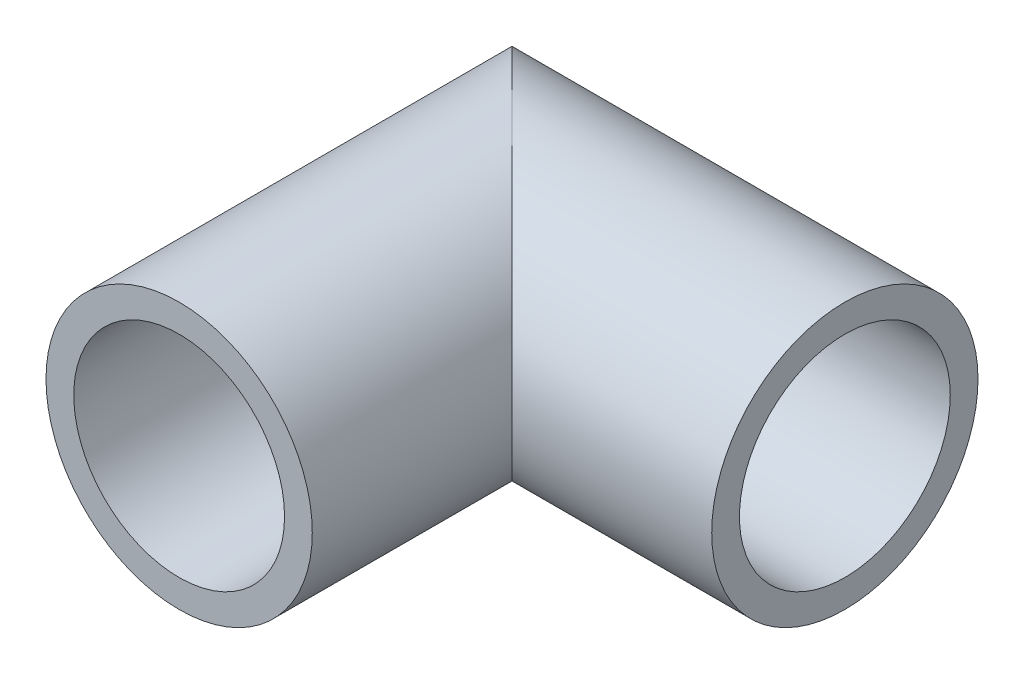
ISO-10303-21;
HEADER;
FILE_DESCRIPTION(('STEP AP214'),'2;1');
FILE_NAME('part.step','',(''),(''),'','','');
FILE_SCHEMA(('AUTOMOTIVE_DESIGN { 1 0 10303 214 1 1 1 1 }'));
ENDSEC;
DATA;
#1=APPLICATION_CONTEXT('core data for automotive mechanical design processes');
#2=APPLICATION_PROTOCOL_DEFINITION('international standard','automotive_design',2000,#1);
#3=PRODUCT_CONTEXT('',#1,'mechanical');
#4=PRODUCT('Part','Part','',(#3));
#5=PRODUCT_RELATED_PRODUCT_CATEGORY('part','',(#4));
#6=PRODUCT_DEFINITION_FORMATION('','',#4);
#7=PRODUCT_DEFINITION_CONTEXT('part definition',#1,'design');
#8=PRODUCT_DEFINITION('design','',#6,#7);
#9=PRODUCT_DEFINITION_SHAPE('','',#8);
#10=(LENGTH_UNIT() NAMED_UNIT(*) SI_UNIT(.MILLI.,.METRE.));
#11=(NAMED_UNIT(*) PLANE_ANGLE_UNIT() SI_UNIT($,.RADIAN.));
#12=(NAMED_UNIT(*) SI_UNIT($,.STERADIAN.) SOLID_ANGLE_UNIT());
#13=UNCERTAINTY_MEASURE_WITH_UNIT(LENGTH_MEASURE(1.E-05),#10,'distance_accuracy_value','');
#14=(GEOMETRIC_REPRESENTATION_CONTEXT(3) GLOBAL_UNCERTAINTY_ASSIGNED_CONTEXT((#13)) GLOBAL_UNIT_ASSIGNED_CONTEXT((#10,
#11,#12)) REPRESENTATION_CONTEXT('',''));
#15=CARTESIAN_POINT('',(0.,0.,0.));
#16=DIRECTION('',(0.,0.,1.));
#17=DIRECTION('',(1.,0.,0.));
#18=AXIS2_PLACEMENT_3D('',#15,#16,#17);
#19=CARTESIAN_POINT('',(0.,0.,-76.2));
#20=DIRECTION('',(1.,0.,0.));
#21=DIRECTION('',(0.,0.,-1.));
#22=AXIS2_PLACEMENT_3D('',#19,#20,#21);
#23=CYLINDRICAL_SURFACE('',#22,30.48);
#24=CARTESIAN_POINT('',(0.,0.,-76.2));
#25=DIRECTION('',(0.707106781186548,0.,-0.707106781186548));
#26=DIRECTION('',(0.707106781186548,0.,0.707106781186548));
#27=AXIS2_PLACEMENT_3D('',#24,#25,#26);
#28=ELLIPSE('',#27,43.1052293811319,30.48);
#29=CARTESIAN_POINT('',(30.48,0.,-45.72));
#30=VERTEX_POINT('',#29);
#31=EDGE_CURVE('E48',#30,#30,#28,.F.);
#32=ORIENTED_EDGE('',*,*,#31,.F.);
#33=EDGE_LOOP('',(#32));
#34=FACE_BOUND('',#33,.T.);
#35=CARTESIAN_POINT('',(76.2,0.,-76.2));
#36=DIRECTION('',(1.,0.,0.));
#37=DIRECTION('',(0.,0.,-1.));
#38=AXIS2_PLACEMENT_3D('',#35,#36,#37);
#39=CIRCLE('',#38,30.48);
#40=CARTESIAN_POINT('',(76.2,0.,-106.68));
#41=VERTEX_POINT('',#40);
#42=EDGE_CURVE('E11',#41,#41,#39,.T.);
#43=ORIENTED_EDGE('',*,*,#42,.F.);
#44=EDGE_LOOP('',(#43));
#45=FACE_BOUND('',#44,.T.);
#46=ADVANCED_FACE('F32',(#34,#45),#23,.T.);
#47=CARTESIAN_POINT('',(0.,0.,-76.2));
#48=DIRECTION('',(1.,0.,0.));
#49=DIRECTION('',(0.,0.,-1.));
#50=AXIS2_PLACEMENT_3D('',#47,#48,#49);
#51=CYLINDRICAL_SURFACE('',#50,24.13);
#52=CARTESIAN_POINT('',(0.,0.,-76.2));
#53=DIRECTION('',(0.707106781186548,0.,-0.707106781186548));
#54=DIRECTION('',(0.707106781186548,0.,0.707106781186548));
#55=AXIS2_PLACEMENT_3D('',#52,#53,#54);
#56=ELLIPSE('',#55,34.1249732600628,24.13);
#57=CARTESIAN_POINT('',(24.13,0.,-52.07));
#58=VERTEX_POINT('',#57);
#59=EDGE_CURVE('E44',#58,#58,#56,.F.);
#60=ORIENTED_EDGE('',*,*,#59,.T.);
#61=EDGE_LOOP('',(#60));
#62=FACE_BOUND('',#61,.T.);
#63=CARTESIAN_POINT('',(76.2,0.,-76.2));
#64=DIRECTION('',(1.,0.,0.));
#65=DIRECTION('',(0.,0.,-1.));
#66=AXIS2_PLACEMENT_3D('',#63,#64,#65);
#67=CIRCLE('',#66,24.13);
#68=CARTESIAN_POINT('',(76.2,0.,-100.33));
#69=VERTEX_POINT('',#68);
#70=EDGE_CURVE('E36',#69,#69,#67,.T.);
#71=ORIENTED_EDGE('',*,*,#70,.T.);
#72=EDGE_LOOP('',(#71));
#73=FACE_BOUND('',#72,.T.);
#74=ADVANCED_FACE('F34',(#62,#73),#51,.F.);
#75=CARTESIAN_POINT('',(0.,0.,-162.410458762264));
#76=DIRECTION('',(0.,0.,1.));
#77=DIRECTION('',(1.,0.,0.));
#78=AXIS2_PLACEMENT_3D('',#75,#76,#77);
#79=CYLINDRICAL_SURFACE('',#78,24.13);
#80=CARTESIAN_POINT('',(0.,0.,0.));
#81=DIRECTION('',(0.,0.,1.));
#82=DIRECTION('',(1.,0.,0.));
#83=AXIS2_PLACEMENT_3D('',#80,#81,#82);
#84=CIRCLE('',#83,24.13);
#85=CARTESIAN_POINT('',(24.13,0.,0.));
#86=VERTEX_POINT('',#85);
#87=EDGE_CURVE('E49',#86,#86,#84,.T.);
#88=ORIENTED_EDGE('',*,*,#87,.T.);
#89=EDGE_LOOP('',(#88));
#90=FACE_BOUND('',#89,.T.);
#91=ORIENTED_EDGE('',*,*,#59,.F.);
#92=EDGE_LOOP('',(#91));
#93=FACE_BOUND('',#92,.T.);
#94=ADVANCED_FACE('F64',(#90,#93),#79,.F.);
#95=CARTESIAN_POINT('',(0.,0.,0.));
#96=DIRECTION('',(0.,0.,1.));
#97=DIRECTION('',(1.,0.,0.));
#98=AXIS2_PLACEMENT_3D('',#95,#96,#97);
#99=PLANE('',#98);
#100=ORIENTED_EDGE('',*,*,#87,.F.);
#101=EDGE_LOOP('',(#100));
#102=FACE_BOUND('',#101,.T.);
#103=CARTESIAN_POINT('',(0.,0.,0.));
#104=DIRECTION('',(0.,0.,1.));
#105=DIRECTION('',(1.,0.,0.));
#106=AXIS2_PLACEMENT_3D('',#103,#104,#105);
#107=CIRCLE('',#106,30.48);
#108=CARTESIAN_POINT('',(30.48,0.,0.));
#109=VERTEX_POINT('',#108);
#110=EDGE_CURVE('E52',#109,#109,#107,.T.);
#111=ORIENTED_EDGE('',*,*,#110,.T.);
#112=EDGE_LOOP('',(#111));
#113=FACE_BOUND('',#112,.T.);
#114=ADVANCED_FACE('F69',(#102,#113),#99,.T.);
#115=CARTESIAN_POINT('',(0.,0.,-162.410458762264));
#116=DIRECTION('',(0.,0.,1.));
#117=DIRECTION('',(1.,0.,0.));
#118=AXIS2_PLACEMENT_3D('',#115,#116,#117);
#119=CYLINDRICAL_SURFACE('',#118,30.48);
#120=ORIENTED_EDGE('',*,*,#110,.F.);
#121=EDGE_LOOP('',(#120));
#122=FACE_BOUND('',#121,.T.);
#123=ORIENTED_EDGE('',*,*,#31,.T.);
#124=EDGE_LOOP('',(#123));
#125=FACE_BOUND('',#124,.T.);
#126=ADVANCED_FACE('F57',(#122,#125),#119,.T.);
#127=CARTESIAN_POINT('',(76.2,0.,-76.2));
#128=DIRECTION('',(1.,0.,0.));
#129=DIRECTION('',(0.,0.,-1.));
#130=AXIS2_PLACEMENT_3D('',#127,#128,#129);
#131=PLANE('',#130);
#132=ORIENTED_EDGE('',*,*,#70,.F.);
#133=EDGE_LOOP('',(#132));
#134=FACE_BOUND('',#133,.T.);
#135=ORIENTED_EDGE('',*,*,#42,.T.);
#136=EDGE_LOOP('',(#135));
#137=FACE_BOUND('',#136,.T.);
#138=ADVANCED_FACE('F73',(#134,#137),#131,.T.);
#139=CLOSED_SHELL('',(#46,#74,#94,#114,#126,#138));
#140=MANIFOLD_SOLID_BREP('B2',#139);
#141=ADVANCED_BREP_SHAPE_REPRESENTATION('',(#18,#140),#14);
#142=SHAPE_DEFINITION_REPRESENTATION(#9,#141);
ENDSEC;
END-ISO-10303-21;
